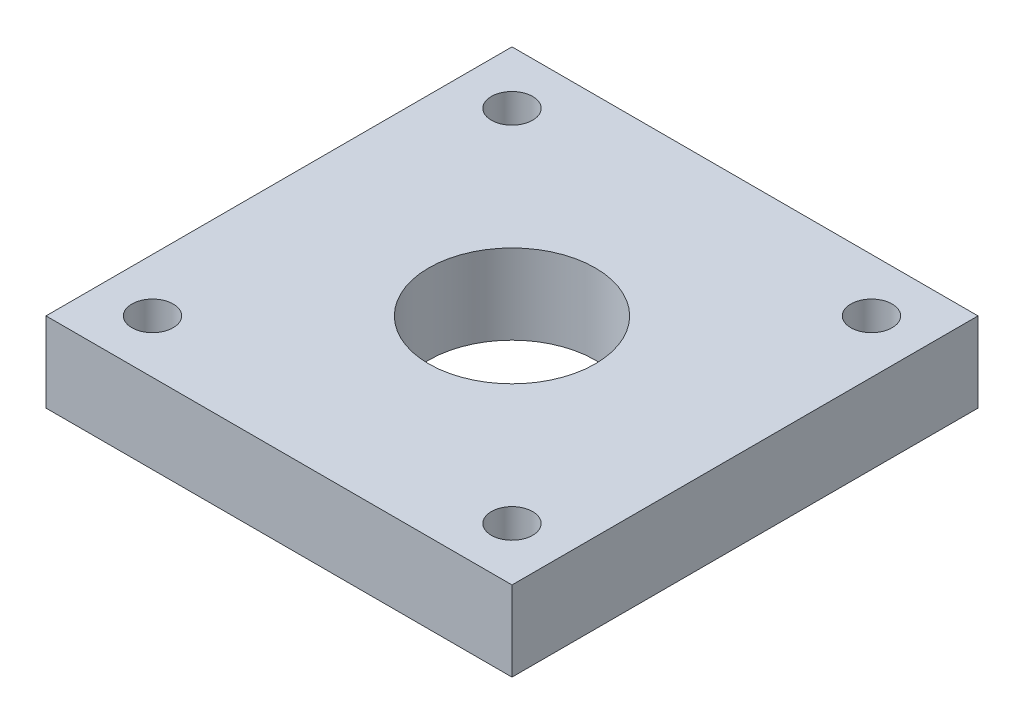
ISO-10303-21;
HEADER;
FILE_DESCRIPTION(('STEP AP214'),'2;1');
FILE_NAME('part.step','',(''),(''),'','','');
FILE_SCHEMA(('AUTOMOTIVE_DESIGN { 1 0 10303 214 1 1 1 1 }'));
ENDSEC;
DATA;
#1=APPLICATION_CONTEXT('core data for automotive mechanical design processes');
#2=APPLICATION_PROTOCOL_DEFINITION('international standard','automotive_design',2000,#1);
#3=PRODUCT_CONTEXT('',#1,'mechanical');
#4=PRODUCT('Part','Part','',(#3));
#5=PRODUCT_RELATED_PRODUCT_CATEGORY('part','',(#4));
#6=PRODUCT_DEFINITION_FORMATION('','',#4);
#7=PRODUCT_DEFINITION_CONTEXT('part definition',#1,'design');
#8=PRODUCT_DEFINITION('design','',#6,#7);
#9=PRODUCT_DEFINITION_SHAPE('','',#8);
#10=(LENGTH_UNIT() NAMED_UNIT(*) SI_UNIT(.MILLI.,.METRE.));
#11=(NAMED_UNIT(*) PLANE_ANGLE_UNIT() SI_UNIT($,.RADIAN.));
#12=(NAMED_UNIT(*) SI_UNIT($,.STERADIAN.) SOLID_ANGLE_UNIT());
#13=UNCERTAINTY_MEASURE_WITH_UNIT(LENGTH_MEASURE(1.E-05),#10,'distance_accuracy_value','');
#14=(GEOMETRIC_REPRESENTATION_CONTEXT(3) GLOBAL_UNCERTAINTY_ASSIGNED_CONTEXT((#13)) GLOBAL_UNIT_ASSIGNED_CONTEXT((#10,
#11,#12)) REPRESENTATION_CONTEXT('',''));
#15=CARTESIAN_POINT('',(0.,0.,0.));
#16=DIRECTION('',(0.,0.,1.));
#17=DIRECTION('',(1.,0.,0.));
#18=AXIS2_PLACEMENT_3D('',#15,#16,#17);
#19=CARTESIAN_POINT('',(0.,0.,0.));
#20=DIRECTION('',(0.,-1.,0.));
#21=DIRECTION('',(0.,0.,-1.));
#22=AXIS2_PLACEMENT_3D('',#19,#20,#21);
#23=PLANE('',#22);
#24=CARTESIAN_POINT('',(-13.5,0.,-13.5));
#25=DIRECTION('',(0.,1.,0.));
#26=DIRECTION('',(0.,0.,1.));
#27=AXIS2_PLACEMENT_3D('',#24,#25,#26);
#28=CIRCLE('',#27,1.54999999999999);
#29=CARTESIAN_POINT('',(-13.5,0.,-11.95));
#30=VERTEX_POINT('',#29);
#31=EDGE_CURVE('E135',#30,#30,#28,.T.);
#32=ORIENTED_EDGE('',*,*,#31,.T.);
#33=EDGE_LOOP('',(#32));
#34=FACE_BOUND('',#33,.T.);
#35=CARTESIAN_POINT('',(13.5,0.,-13.5));
#36=DIRECTION('',(0.,1.,0.));
#37=DIRECTION('',(0.,0.,1.));
#38=AXIS2_PLACEMENT_3D('',#35,#36,#37);
#39=CIRCLE('',#38,1.54999999999999);
#40=CARTESIAN_POINT('',(13.5,0.,-11.95));
#41=VERTEX_POINT('',#40);
#42=EDGE_CURVE('E129',#41,#41,#39,.T.);
#43=ORIENTED_EDGE('',*,*,#42,.T.);
#44=EDGE_LOOP('',(#43));
#45=FACE_BOUND('',#44,.T.);
#46=CARTESIAN_POINT('',(13.5,0.,13.5));
#47=DIRECTION('',(0.,1.,0.));
#48=DIRECTION('',(0.,0.,1.));
#49=AXIS2_PLACEMENT_3D('',#46,#47,#48);
#50=CIRCLE('',#49,1.54999999999999);
#51=CARTESIAN_POINT('',(13.5,0.,15.05));
#52=VERTEX_POINT('',#51);
#53=EDGE_CURVE('E123',#52,#52,#50,.T.);
#54=ORIENTED_EDGE('',*,*,#53,.T.);
#55=EDGE_LOOP('',(#54));
#56=FACE_BOUND('',#55,.T.);
#57=CARTESIAN_POINT('',(0.,0.,0.));
#58=DIRECTION('',(0.,1.,0.));
#59=DIRECTION('',(0.,0.,1.));
#60=AXIS2_PLACEMENT_3D('',#57,#58,#59);
#61=CIRCLE('',#60,6.25);
#62=CARTESIAN_POINT('',(0.,0.,6.25000000000001));
#63=VERTEX_POINT('',#62);
#64=EDGE_CURVE('E112',#63,#63,#61,.T.);
#65=ORIENTED_EDGE('',*,*,#64,.T.);
#66=EDGE_LOOP('',(#65));
#67=FACE_BOUND('',#66,.T.);
#68=DIRECTION('',(0.,0.,-1.));
#69=VECTOR('',#68,1.);
#70=CARTESIAN_POINT('',(17.5,0.,17.5));
#71=LINE('',#70,#69);
#72=CARTESIAN_POINT('',(17.5,0.,17.5));
#73=VERTEX_POINT('',#72);
#74=CARTESIAN_POINT('',(17.5,0.,-17.5));
#75=VERTEX_POINT('',#74);
#76=EDGE_CURVE('E98',#73,#75,#71,.T.);
#77=ORIENTED_EDGE('',*,*,#76,.F.);
#78=DIRECTION('',(1.,0.,0.));
#79=VECTOR('',#78,1.);
#80=CARTESIAN_POINT('',(-17.5,0.,17.5));
#81=LINE('',#80,#79);
#82=CARTESIAN_POINT('',(-17.5,0.,17.5));
#83=VERTEX_POINT('',#82);
#84=EDGE_CURVE('E73',#83,#73,#81,.T.);
#85=ORIENTED_EDGE('',*,*,#84,.F.);
#86=DIRECTION('',(0.,0.,1.));
#87=VECTOR('',#86,1.);
#88=CARTESIAN_POINT('',(-17.5,0.,17.5));
#89=LINE('',#88,#87);
#90=CARTESIAN_POINT('',(-17.5,0.,-17.5));
#91=VERTEX_POINT('',#90);
#92=EDGE_CURVE('E67',#91,#83,#89,.T.);
#93=ORIENTED_EDGE('',*,*,#92,.F.);
#94=DIRECTION('',(-1.,0.,0.));
#95=VECTOR('',#94,1.);
#96=CARTESIAN_POINT('',(-17.5,0.,-17.5));
#97=LINE('',#96,#95);
#98=EDGE_CURVE('E90',#75,#91,#97,.T.);
#99=ORIENTED_EDGE('',*,*,#98,.F.);
#100=EDGE_LOOP('',(#77,#85,#93,#99));
#101=FACE_BOUND('',#100,.T.);
#102=CARTESIAN_POINT('',(-13.5,0.,13.5));
#103=DIRECTION('',(0.,1.,0.));
#104=DIRECTION('',(0.,0.,1.));
#105=AXIS2_PLACEMENT_3D('',#102,#103,#104);
#106=CIRCLE('',#105,1.54999999999999);
#107=CARTESIAN_POINT('',(-13.5,0.,15.05));
#108=VERTEX_POINT('',#107);
#109=EDGE_CURVE('E115',#108,#108,#106,.T.);
#110=ORIENTED_EDGE('',*,*,#109,.T.);
#111=EDGE_LOOP('',(#110));
#112=FACE_BOUND('',#111,.T.);
#113=ADVANCED_FACE('F33',(#34,#45,#56,#67,#101,#112),#23,.T.);
#114=CARTESIAN_POINT('',(0.,6.,0.));
#115=DIRECTION('',(0.,-1.,0.));
#116=DIRECTION('',(0.,0.,-1.));
#117=AXIS2_PLACEMENT_3D('',#114,#115,#116);
#118=PLANE('',#117);
#119=CARTESIAN_POINT('',(-13.5,6.,-13.5));
#120=DIRECTION('',(0.,1.,0.));
#121=DIRECTION('',(0.,0.,1.));
#122=AXIS2_PLACEMENT_3D('',#119,#120,#121);
#123=CIRCLE('',#122,1.54999999999999);
#124=CARTESIAN_POINT('',(-13.5,6.,-11.95));
#125=VERTEX_POINT('',#124);
#126=EDGE_CURVE('E138',#125,#125,#123,.T.);
#127=ORIENTED_EDGE('',*,*,#126,.F.);
#128=EDGE_LOOP('',(#127));
#129=FACE_BOUND('',#128,.T.);
#130=CARTESIAN_POINT('',(13.5,6.,-13.5));
#131=DIRECTION('',(0.,1.,0.));
#132=DIRECTION('',(0.,0.,1.));
#133=AXIS2_PLACEMENT_3D('',#130,#131,#132);
#134=CIRCLE('',#133,1.54999999999999);
#135=CARTESIAN_POINT('',(13.5,6.,-11.95));
#136=VERTEX_POINT('',#135);
#137=EDGE_CURVE('E132',#136,#136,#134,.T.);
#138=ORIENTED_EDGE('',*,*,#137,.F.);
#139=EDGE_LOOP('',(#138));
#140=FACE_BOUND('',#139,.T.);
#141=CARTESIAN_POINT('',(13.5,6.,13.5));
#142=DIRECTION('',(0.,1.,0.));
#143=DIRECTION('',(0.,0.,1.));
#144=AXIS2_PLACEMENT_3D('',#141,#142,#143);
#145=CIRCLE('',#144,1.54999999999999);
#146=CARTESIAN_POINT('',(13.5,6.,15.05));
#147=VERTEX_POINT('',#146);
#148=EDGE_CURVE('E126',#147,#147,#145,.T.);
#149=ORIENTED_EDGE('',*,*,#148,.F.);
#150=EDGE_LOOP('',(#149));
#151=FACE_BOUND('',#150,.T.);
#152=CARTESIAN_POINT('',(-13.5,6.,13.5));
#153=DIRECTION('',(0.,1.,0.));
#154=DIRECTION('',(0.,0.,1.));
#155=AXIS2_PLACEMENT_3D('',#152,#153,#154);
#156=CIRCLE('',#155,1.54999999999999);
#157=CARTESIAN_POINT('',(-13.5,6.,15.05));
#158=VERTEX_POINT('',#157);
#159=EDGE_CURVE('E120',#158,#158,#156,.T.);
#160=ORIENTED_EDGE('',*,*,#159,.F.);
#161=EDGE_LOOP('',(#160));
#162=FACE_BOUND('',#161,.T.);
#163=DIRECTION('',(0.,0.,-1.));
#164=VECTOR('',#163,1.);
#165=CARTESIAN_POINT('',(17.5,6.,17.5));
#166=LINE('',#165,#164);
#167=CARTESIAN_POINT('',(17.5,6.,17.5));
#168=VERTEX_POINT('',#167);
#169=CARTESIAN_POINT('',(17.5,6.,-17.5));
#170=VERTEX_POINT('',#169);
#171=EDGE_CURVE('E86',#168,#170,#166,.T.);
#172=ORIENTED_EDGE('',*,*,#171,.T.);
#173=DIRECTION('',(-1.,0.,0.));
#174=VECTOR('',#173,1.);
#175=CARTESIAN_POINT('',(-17.5,6.,-17.5));
#176=LINE('',#175,#174);
#177=CARTESIAN_POINT('',(-17.5,6.,-17.5));
#178=VERTEX_POINT('',#177);
#179=EDGE_CURVE('E80',#170,#178,#176,.T.);
#180=ORIENTED_EDGE('',*,*,#179,.T.);
#181=DIRECTION('',(0.,0.,1.));
#182=VECTOR('',#181,1.);
#183=CARTESIAN_POINT('',(-17.5,6.,17.5));
#184=LINE('',#183,#182);
#185=CARTESIAN_POINT('',(-17.5,6.,17.5));
#186=VERTEX_POINT('',#185);
#187=EDGE_CURVE('E84',#178,#186,#184,.T.);
#188=ORIENTED_EDGE('',*,*,#187,.T.);
#189=DIRECTION('',(1.,0.,0.));
#190=VECTOR('',#189,1.);
#191=CARTESIAN_POINT('',(-17.5,6.,17.5));
#192=LINE('',#191,#190);
#193=EDGE_CURVE('E50',#186,#168,#192,.T.);
#194=ORIENTED_EDGE('',*,*,#193,.T.);
#195=EDGE_LOOP('',(#172,#180,#188,#194));
#196=FACE_BOUND('',#195,.T.);
#197=CARTESIAN_POINT('',(0.,6.,0.));
#198=DIRECTION('',(0.,1.,0.));
#199=DIRECTION('',(0.,0.,1.));
#200=AXIS2_PLACEMENT_3D('',#197,#198,#199);
#201=CIRCLE('',#200,6.25);
#202=CARTESIAN_POINT('',(0.,6.,6.25000000000001));
#203=VERTEX_POINT('',#202);
#204=EDGE_CURVE('E101',#203,#203,#201,.T.);
#205=ORIENTED_EDGE('',*,*,#204,.F.);
#206=EDGE_LOOP('',(#205));
#207=FACE_BOUND('',#206,.T.);
#208=ADVANCED_FACE('F81',(#129,#140,#151,#162,#196,#207),#118,.F.);
#209=CARTESIAN_POINT('',(17.5,6.,17.5));
#210=DIRECTION('',(-1.,0.,0.));
#211=DIRECTION('',(0.,0.,1.));
#212=AXIS2_PLACEMENT_3D('',#209,#210,#211);
#213=PLANE('',#212);
#214=ORIENTED_EDGE('',*,*,#76,.T.);
#215=DIRECTION('',(0.,-1.,0.));
#216=VECTOR('',#215,1.);
#217=CARTESIAN_POINT('',(17.5,6.,-17.5));
#218=LINE('',#217,#216);
#219=EDGE_CURVE('E11',#170,#75,#218,.T.);
#220=ORIENTED_EDGE('',*,*,#219,.F.);
#221=ORIENTED_EDGE('',*,*,#171,.F.);
#222=DIRECTION('',(0.,-1.,0.));
#223=VECTOR('',#222,1.);
#224=CARTESIAN_POINT('',(17.5,6.,17.5));
#225=LINE('',#224,#223);
#226=EDGE_CURVE('E94',#168,#73,#225,.T.);
#227=ORIENTED_EDGE('',*,*,#226,.T.);
#228=EDGE_LOOP('',(#214,#220,#221,#227));
#229=FACE_BOUND('',#228,.T.);
#230=ADVANCED_FACE('F35',(#229),#213,.F.);
#231=CARTESIAN_POINT('',(-17.5,6.,-17.5));
#232=DIRECTION('',(0.,0.,1.));
#233=DIRECTION('',(1.,0.,0.));
#234=AXIS2_PLACEMENT_3D('',#231,#232,#233);
#235=PLANE('',#234);
#236=ORIENTED_EDGE('',*,*,#98,.T.);
#237=DIRECTION('',(0.,-1.,0.));
#238=VECTOR('',#237,1.);
#239=CARTESIAN_POINT('',(-17.5,6.,-17.5));
#240=LINE('',#239,#238);
#241=EDGE_CURVE('E42',#178,#91,#240,.T.);
#242=ORIENTED_EDGE('',*,*,#241,.F.);
#243=ORIENTED_EDGE('',*,*,#179,.F.);
#244=ORIENTED_EDGE('',*,*,#219,.T.);
#245=EDGE_LOOP('',(#236,#242,#243,#244));
#246=FACE_BOUND('',#245,.T.);
#247=ADVANCED_FACE('F89',(#246),#235,.F.);
#248=CARTESIAN_POINT('',(-17.5,6.,17.5));
#249=DIRECTION('',(1.,0.,0.));
#250=DIRECTION('',(0.,0.,-1.));
#251=AXIS2_PLACEMENT_3D('',#248,#249,#250);
#252=PLANE('',#251);
#253=ORIENTED_EDGE('',*,*,#92,.T.);
#254=DIRECTION('',(0.,-1.,0.));
#255=VECTOR('',#254,1.);
#256=CARTESIAN_POINT('',(-17.5,6.,17.5));
#257=LINE('',#256,#255);
#258=EDGE_CURVE('E91',#186,#83,#257,.T.);
#259=ORIENTED_EDGE('',*,*,#258,.F.);
#260=ORIENTED_EDGE('',*,*,#187,.F.);
#261=ORIENTED_EDGE('',*,*,#241,.T.);
#262=EDGE_LOOP('',(#253,#259,#260,#261));
#263=FACE_BOUND('',#262,.T.);
#264=ADVANCED_FACE('F92',(#263),#252,.F.);
#265=CARTESIAN_POINT('',(-17.5,6.,17.5));
#266=DIRECTION('',(0.,0.,-1.));
#267=DIRECTION('',(-1.,0.,0.));
#268=AXIS2_PLACEMENT_3D('',#265,#266,#267);
#269=PLANE('',#268);
#270=ORIENTED_EDGE('',*,*,#84,.T.);
#271=ORIENTED_EDGE('',*,*,#226,.F.);
#272=ORIENTED_EDGE('',*,*,#193,.F.);
#273=ORIENTED_EDGE('',*,*,#258,.T.);
#274=EDGE_LOOP('',(#270,#271,#272,#273));
#275=FACE_BOUND('',#274,.T.);
#276=ADVANCED_FACE('F106',(#275),#269,.F.);
#277=CARTESIAN_POINT('',(0.,6.,0.));
#278=DIRECTION('',(0.,-1.,0.));
#279=DIRECTION('',(0.,0.,-1.));
#280=AXIS2_PLACEMENT_3D('',#277,#278,#279);
#281=CYLINDRICAL_SURFACE('',#280,6.25);
#282=ORIENTED_EDGE('',*,*,#204,.T.);
#283=EDGE_LOOP('',(#282));
#284=FACE_BOUND('',#283,.T.);
#285=ORIENTED_EDGE('',*,*,#64,.F.);
#286=EDGE_LOOP('',(#285));
#287=FACE_BOUND('',#286,.T.);
#288=ADVANCED_FACE('F156',(#284,#287),#281,.F.);
#289=CARTESIAN_POINT('',(-13.5,6.,13.5));
#290=DIRECTION('',(0.,1.,0.));
#291=DIRECTION('',(0.,0.,1.));
#292=AXIS2_PLACEMENT_3D('',#289,#290,#291);
#293=CYLINDRICAL_SURFACE('',#292,1.54999999999999);
#294=ORIENTED_EDGE('',*,*,#109,.F.);
#295=EDGE_LOOP('',(#294));
#296=FACE_BOUND('',#295,.T.);
#297=ORIENTED_EDGE('',*,*,#159,.T.);
#298=EDGE_LOOP('',(#297));
#299=FACE_BOUND('',#298,.T.);
#300=ADVANCED_FACE('F153',(#296,#299),#293,.F.);
#301=CARTESIAN_POINT('',(13.5,6.,13.5));
#302=DIRECTION('',(0.,1.,0.));
#303=DIRECTION('',(0.,0.,1.));
#304=AXIS2_PLACEMENT_3D('',#301,#302,#303);
#305=CYLINDRICAL_SURFACE('',#304,1.54999999999999);
#306=ORIENTED_EDGE('',*,*,#53,.F.);
#307=EDGE_LOOP('',(#306));
#308=FACE_BOUND('',#307,.T.);
#309=ORIENTED_EDGE('',*,*,#148,.T.);
#310=EDGE_LOOP('',(#309));
#311=FACE_BOUND('',#310,.T.);
#312=ADVANCED_FACE('F155',(#308,#311),#305,.F.);
#313=CARTESIAN_POINT('',(13.5,6.,-13.5));
#314=DIRECTION('',(0.,1.,0.));
#315=DIRECTION('',(0.,0.,1.));
#316=AXIS2_PLACEMENT_3D('',#313,#314,#315);
#317=CYLINDRICAL_SURFACE('',#316,1.54999999999999);
#318=ORIENTED_EDGE('',*,*,#42,.F.);
#319=EDGE_LOOP('',(#318));
#320=FACE_BOUND('',#319,.T.);
#321=ORIENTED_EDGE('',*,*,#137,.T.);
#322=EDGE_LOOP('',(#321));
#323=FACE_BOUND('',#322,.T.);
#324=ADVANCED_FACE('F163',(#320,#323),#317,.F.);
#325=CARTESIAN_POINT('',(-13.5,6.,-13.5));
#326=DIRECTION('',(0.,1.,0.));
#327=DIRECTION('',(0.,0.,1.));
#328=AXIS2_PLACEMENT_3D('',#325,#326,#327);
#329=CYLINDRICAL_SURFACE('',#328,1.54999999999999);
#330=ORIENTED_EDGE('',*,*,#31,.F.);
#331=EDGE_LOOP('',(#330));
#332=FACE_BOUND('',#331,.T.);
#333=ORIENTED_EDGE('',*,*,#126,.T.);
#334=EDGE_LOOP('',(#333));
#335=FACE_BOUND('',#334,.T.);
#336=ADVANCED_FACE('F142',(#332,#335),#329,.F.);
#337=CLOSED_SHELL('',(#113,#208,#230,#247,#264,#276,#288,#300,#312,#324,#336));
#338=MANIFOLD_SOLID_BREP('B2',#337);
#339=ADVANCED_BREP_SHAPE_REPRESENTATION('',(#18,#338),#14);
#340=SHAPE_DEFINITION_REPRESENTATION(#9,#339);
ENDSEC;
END-ISO-10303-21;
